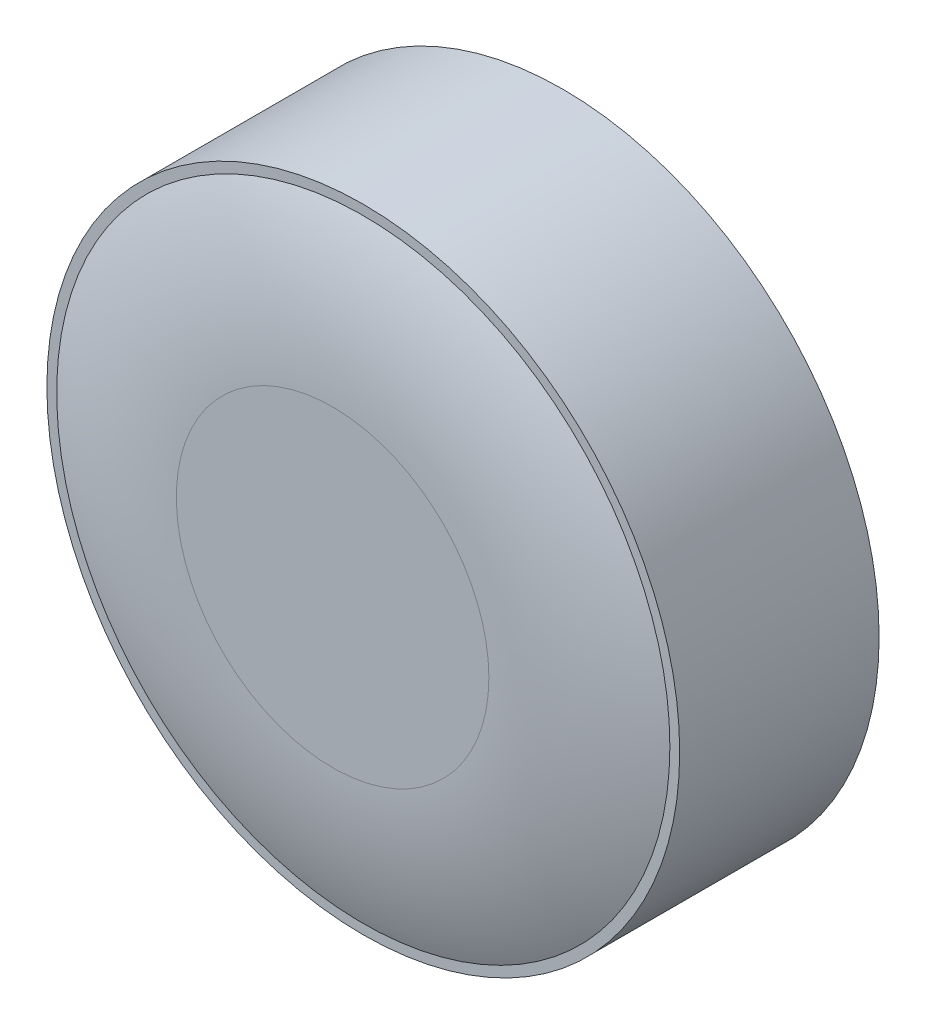
ISO-10303-21;
HEADER;
FILE_DESCRIPTION(('STEP AP214'),'2;1');
FILE_NAME('part.step','',(''),(''),'','','');
FILE_SCHEMA(('AUTOMOTIVE_DESIGN { 1 0 10303 214 1 1 1 1 }'));
ENDSEC;
DATA;
#1=APPLICATION_CONTEXT('core data for automotive mechanical design processes');
#2=APPLICATION_PROTOCOL_DEFINITION('international standard','automotive_design',2000,#1);
#3=PRODUCT_CONTEXT('',#1,'mechanical');
#4=PRODUCT('Part','Part','',(#3));
#5=PRODUCT_RELATED_PRODUCT_CATEGORY('part','',(#4));
#6=PRODUCT_DEFINITION_FORMATION('','',#4);
#7=PRODUCT_DEFINITION_CONTEXT('part definition',#1,'design');
#8=PRODUCT_DEFINITION('design','',#6,#7);
#9=PRODUCT_DEFINITION_SHAPE('','',#8);
#10=(LENGTH_UNIT() NAMED_UNIT(*) SI_UNIT(.MILLI.,.METRE.));
#11=(NAMED_UNIT(*) PLANE_ANGLE_UNIT() SI_UNIT($,.RADIAN.));
#12=(NAMED_UNIT(*) SI_UNIT($,.STERADIAN.) SOLID_ANGLE_UNIT());
#13=UNCERTAINTY_MEASURE_WITH_UNIT(LENGTH_MEASURE(1.E-05),#10,'distance_accuracy_value','');
#14=(GEOMETRIC_REPRESENTATION_CONTEXT(3) GLOBAL_UNCERTAINTY_ASSIGNED_CONTEXT((#13)) GLOBAL_UNIT_ASSIGNED_CONTEXT((#10,
#11,#12)) REPRESENTATION_CONTEXT('',''));
#15=CARTESIAN_POINT('',(0.,0.,0.));
#16=DIRECTION('',(0.,0.,1.));
#17=DIRECTION('',(1.,0.,0.));
#18=AXIS2_PLACEMENT_3D('',#15,#16,#17);
#19=CARTESIAN_POINT('',(0.,0.,0.));
#20=DIRECTION('',(0.,0.,1.));
#21=DIRECTION('',(1.,0.,0.));
#22=AXIS2_PLACEMENT_3D('',#19,#20,#21);
#23=PLANE('',#22);
#24=CARTESIAN_POINT('',(0.,0.,0.));
#25=DIRECTION('',(0.,0.,1.));
#26=DIRECTION('',(1.,0.,0.));
#27=AXIS2_PLACEMENT_3D('',#24,#25,#26);
#28=CIRCLE('',#27,8.25);
#29=CARTESIAN_POINT('',(8.25,0.,0.));
#30=VERTEX_POINT('',#29);
#31=EDGE_CURVE('E50',#30,#30,#28,.T.);
#32=ORIENTED_EDGE('',*,*,#31,.F.);
#33=EDGE_LOOP('',(#32));
#34=FACE_BOUND('',#33,.T.);
#35=ADVANCED_FACE('F39',(#34),#23,.F.);
#36=CARTESIAN_POINT('',(0.,0.,5.2));
#37=DIRECTION('',(0.,0.,-1.));
#38=DIRECTION('',(-1.,0.,0.));
#39=AXIS2_PLACEMENT_3D('',#36,#37,#38);
#40=CYLINDRICAL_SURFACE('',#39,8.25);
#41=CARTESIAN_POINT('',(0.,0.,5.2));
#42=DIRECTION('',(0.,0.,1.));
#43=DIRECTION('',(1.,0.,0.));
#44=AXIS2_PLACEMENT_3D('',#41,#42,#43);
#45=CIRCLE('',#44,8.25);
#46=CARTESIAN_POINT('',(8.25,0.,5.2));
#47=VERTEX_POINT('',#46);
#48=EDGE_CURVE('E46',#47,#47,#45,.T.);
#49=ORIENTED_EDGE('',*,*,#48,.F.);
#50=EDGE_LOOP('',(#49));
#51=FACE_BOUND('',#50,.T.);
#52=ORIENTED_EDGE('',*,*,#31,.T.);
#53=EDGE_LOOP('',(#52));
#54=FACE_BOUND('',#53,.T.);
#55=ADVANCED_FACE('F69',(#51,#54),#40,.T.);
#56=CARTESIAN_POINT('',(0.,0.,5.2));
#57=DIRECTION('',(0.,0.,1.));
#58=DIRECTION('',(1.,0.,0.));
#59=AXIS2_PLACEMENT_3D('',#56,#57,#58);
#60=PLANE('',#59);
#61=CARTESIAN_POINT('',(0.,0.,5.2));
#62=DIRECTION('',(0.,0.,1.));
#63=DIRECTION('',(1.,0.,0.));
#64=AXIS2_PLACEMENT_3D('',#61,#62,#63);
#65=CIRCLE('',#64,7.99403228338793);
#66=CARTESIAN_POINT('',(7.99403228338793,0.,5.2));
#67=VERTEX_POINT('',#66);
#68=EDGE_CURVE('E55',#67,#67,#65,.F.);
#69=ORIENTED_EDGE('',*,*,#68,.T.);
#70=EDGE_LOOP('',(#69));
#71=FACE_BOUND('',#70,.T.);
#72=ORIENTED_EDGE('',*,*,#48,.T.);
#73=EDGE_LOOP('',(#72));
#74=FACE_BOUND('',#73,.T.);
#75=ADVANCED_FACE('F60',(#71,#74),#60,.T.);
#76=CARTESIAN_POINT('',(0.,0.,6.));
#77=DIRECTION('',(0.,0.,1.));
#78=DIRECTION('',(1.,0.,0.));
#79=AXIS2_PLACEMENT_3D('',#76,#77,#78);
#80=PLANE('',#79);
#81=CARTESIAN_POINT('',(0.,0.,6.));
#82=DIRECTION('',(0.,0.,1.));
#83=DIRECTION('',(1.,0.,0.));
#84=AXIS2_PLACEMENT_3D('',#81,#82,#83);
#85=CIRCLE('',#84,4.07484869493485);
#86=CARTESIAN_POINT('',(4.07484869493485,0.,6.));
#87=VERTEX_POINT('',#86);
#88=EDGE_CURVE('E11',#87,#87,#85,.T.);
#89=ORIENTED_EDGE('',*,*,#88,.T.);
#90=EDGE_LOOP('',(#89));
#91=FACE_BOUND('',#90,.T.);
#92=ADVANCED_FACE('F64',(#91),#80,.T.);
#93=CARTESIAN_POINT('',(0.,0.,-4.));
#94=DIRECTION('',(0.,0.,-1.));
#95=DIRECTION('',(-1.,0.,0.));
#96=AXIS2_PLACEMENT_3D('',#93,#94,#95);
#97=DEGENERATE_TOROIDAL_SURFACE('',#96,4.07484869493485,10.,.T.);
#98=ORIENTED_EDGE('',*,*,#68,.F.);
#99=EDGE_LOOP('',(#98));
#100=FACE_BOUND('',#99,.T.);
#101=ORIENTED_EDGE('',*,*,#88,.F.);
#102=EDGE_LOOP('',(#101));
#103=FACE_BOUND('',#102,.T.);
#104=ADVANCED_FACE('F41',(#100,#103),#97,.T.);
#105=CLOSED_SHELL('',(#35,#55,#75,#92,#104));
#106=MANIFOLD_SOLID_BREP('B2',#105);
#107=ADVANCED_BREP_SHAPE_REPRESENTATION('',(#18,#106),#14);
#108=SHAPE_DEFINITION_REPRESENTATION(#9,#107);
ENDSEC;
END-ISO-10303-21;
